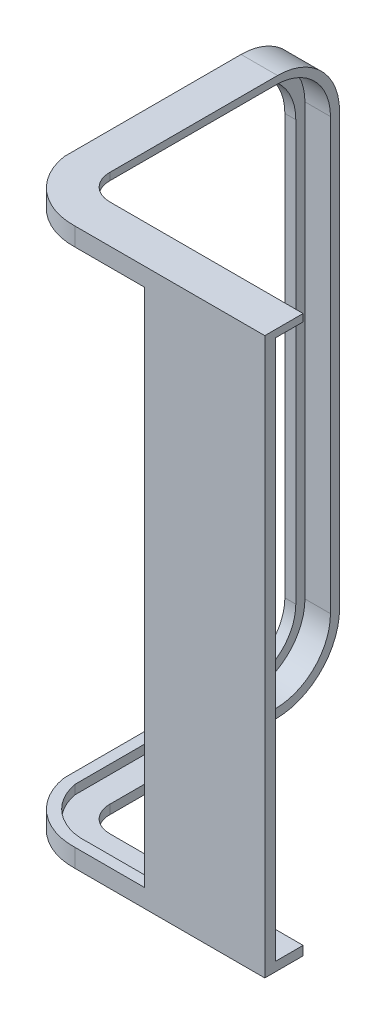
ISO-10303-21;
HEADER;
FILE_DESCRIPTION(('STEP AP214'),'2;1');
FILE_NAME('part.step','',(''),(''),'','','');
FILE_SCHEMA(('AUTOMOTIVE_DESIGN { 1 0 10303 214 1 1 1 1 }'));
ENDSEC;
DATA;
#1=APPLICATION_CONTEXT('core data for automotive mechanical design processes');
#2=APPLICATION_PROTOCOL_DEFINITION('international standard','automotive_design',2000,#1);
#3=PRODUCT_CONTEXT('',#1,'mechanical');
#4=PRODUCT('Part','Part','',(#3));
#5=PRODUCT_RELATED_PRODUCT_CATEGORY('part','',(#4));
#6=PRODUCT_DEFINITION_FORMATION('','',#4);
#7=PRODUCT_DEFINITION_CONTEXT('part definition',#1,'design');
#8=PRODUCT_DEFINITION('design','',#6,#7);
#9=PRODUCT_DEFINITION_SHAPE('','',#8);
#10=(LENGTH_UNIT() NAMED_UNIT(*) SI_UNIT(.MILLI.,.METRE.));
#11=(NAMED_UNIT(*) PLANE_ANGLE_UNIT() SI_UNIT($,.RADIAN.));
#12=(NAMED_UNIT(*) SI_UNIT($,.STERADIAN.) SOLID_ANGLE_UNIT());
#13=UNCERTAINTY_MEASURE_WITH_UNIT(LENGTH_MEASURE(1.E-05),#10,'distance_accuracy_value','');
#14=(GEOMETRIC_REPRESENTATION_CONTEXT(3) GLOBAL_UNCERTAINTY_ASSIGNED_CONTEXT((#13)) GLOBAL_UNIT_ASSIGNED_CONTEXT((#10,
#11,#12)) REPRESENTATION_CONTEXT('',''));
#15=CARTESIAN_POINT('',(0.,0.,0.));
#16=DIRECTION('',(0.,0.,1.));
#17=DIRECTION('',(1.,0.,0.));
#18=AXIS2_PLACEMENT_3D('',#15,#16,#17);
#19=CARTESIAN_POINT('',(-38.5,148.,3.));
#20=DIRECTION('',(-1.,0.,0.));
#21=DIRECTION('',(0.,0.,1.));
#22=AXIS2_PLACEMENT_3D('',#19,#20,#21);
#23=PLANE('',#22);
#24=DIRECTION('',(0.,-1.,0.));
#25=VECTOR('',#24,1.);
#26=CARTESIAN_POINT('',(-38.5,148.,0.));
#27=LINE('',#26,#25);
#28=CARTESIAN_POINT('',(-38.5,148.000000000001,0.));
#29=VERTEX_POINT('',#28);
#30=CARTESIAN_POINT('',(-38.5,0.,0.));
#31=VERTEX_POINT('',#30);
#32=EDGE_CURVE('E262',#29,#31,#27,.T.);
#33=ORIENTED_EDGE('',*,*,#32,.F.);
#34=DIRECTION('',(0.,0.,1.));
#35=VECTOR('',#34,1.);
#36=CARTESIAN_POINT('',(-38.5,148.000000000001,-14.6342860104149));
#37=LINE('',#36,#35);
#38=CARTESIAN_POINT('',(-38.5,148.000000000001,-7.50000000000164));
#39=VERTEX_POINT('',#38);
#40=EDGE_CURVE('E393',#39,#29,#37,.T.);
#41=ORIENTED_EDGE('',*,*,#40,.F.);
#42=DIRECTION('',(0.,-1.,0.));
#43=VECTOR('',#42,1.);
#44=CARTESIAN_POINT('',(-38.5,150.000000000001,-7.50000000000167));
#45=LINE('',#44,#43);
#46=CARTESIAN_POINT('',(-38.5,150.000000000001,-7.50000000000166));
#47=VERTEX_POINT('',#46);
#48=EDGE_CURVE('E267',#47,#39,#45,.T.);
#49=ORIENTED_EDGE('',*,*,#48,.F.);
#50=DIRECTION('',(0.,0.,1.));
#51=VECTOR('',#50,1.);
#52=CARTESIAN_POINT('',(-38.5,150.000000000001,-14.634286010415));
#53=LINE('',#52,#51);
#54=CARTESIAN_POINT('',(-38.5,150.000000000001,3.00000000000005));
#55=VERTEX_POINT('',#54);
#56=EDGE_CURVE('E265',#47,#55,#53,.T.);
#57=ORIENTED_EDGE('',*,*,#56,.T.);
#58=DIRECTION('',(0.,-1.,0.));
#59=VECTOR('',#58,1.);
#60=CARTESIAN_POINT('',(-38.5,148.,3.));
#61=LINE('',#60,#59);
#62=CARTESIAN_POINT('',(-38.5,-2.5,3.));
#63=VERTEX_POINT('',#62);
#64=EDGE_CURVE('E251',#55,#63,#61,.T.);
#65=ORIENTED_EDGE('',*,*,#64,.T.);
#66=DIRECTION('',(0.,0.,1.));
#67=VECTOR('',#66,1.);
#68=CARTESIAN_POINT('',(-38.5,-2.5,-7.5));
#69=LINE('',#68,#67);
#70=CARTESIAN_POINT('',(-38.5,-2.5,-7.5));
#71=VERTEX_POINT('',#70);
#72=EDGE_CURVE('E397',#71,#63,#69,.T.);
#73=ORIENTED_EDGE('',*,*,#72,.F.);
#74=DIRECTION('',(0.,-1.,0.));
#75=VECTOR('',#74,1.);
#76=CARTESIAN_POINT('',(-38.5,0.,-7.5));
#77=LINE('',#76,#75);
#78=CARTESIAN_POINT('',(-38.5,0.,-7.5));
#79=VERTEX_POINT('',#78);
#80=EDGE_CURVE('E379',#79,#71,#77,.T.);
#81=ORIENTED_EDGE('',*,*,#80,.F.);
#82=DIRECTION('',(0.,0.,-1.));
#83=VECTOR('',#82,1.);
#84=CARTESIAN_POINT('',(-38.5,0.,0.));
#85=LINE('',#84,#83);
#86=EDGE_CURVE('E390',#31,#79,#85,.T.);
#87=ORIENTED_EDGE('',*,*,#86,.F.);
#88=EDGE_LOOP('',(#33,#41,#49,#57,#65,#73,#81,#87));
#89=FACE_BOUND('',#88,.T.);
#90=ADVANCED_FACE('F38',(#89),#23,.F.);
#91=CARTESIAN_POINT('',(91.0545653325302,148.000000000001,-14.6342860104149));
#92=DIRECTION('',(0.,1.,0.));
#93=DIRECTION('',(0.,0.,1.));
#94=AXIS2_PLACEMENT_3D('',#91,#92,#93);
#95=PLANE('',#94);
#96=DIRECTION('',(-1.,0.,0.));
#97=VECTOR('',#96,1.);
#98=CARTESIAN_POINT('',(0.,148.000000000001,-7.50000000000164));
#99=LINE('',#98,#97);
#100=CARTESIAN_POINT('',(-91.5,148.000000000001,-7.50000000000164));
#101=VERTEX_POINT('',#100);
#102=EDGE_CURVE('E284',#39,#101,#99,.T.);
#103=ORIENTED_EDGE('',*,*,#102,.F.);
#104=ORIENTED_EDGE('',*,*,#40,.T.);
#105=DIRECTION('',(-1.,0.,0.));
#106=VECTOR('',#105,1.);
#107=CARTESIAN_POINT('',(71.5,148.,0.));
#108=LINE('',#107,#106);
#109=CARTESIAN_POINT('',(-71.5,148.,0.));
#110=VERTEX_POINT('',#109);
#111=EDGE_CURVE('E297',#29,#110,#108,.T.);
#112=ORIENTED_EDGE('',*,*,#111,.T.);
#113=DIRECTION('',(-0.999997928383092,0.,0.00203549245239582));
#114=VECTOR('',#113,1.);
#115=CARTESIAN_POINT('',(-90.4936212545622,148.000000000001,0.0386614527974023));
#116=LINE('',#115,#114);
#117=CARTESIAN_POINT('',(-90.4936212545622,148.000000000001,0.0386614527974026));
#118=VERTEX_POINT('',#117);
#119=EDGE_CURVE('E431',#110,#118,#116,.T.);
#120=ORIENTED_EDGE('',*,*,#119,.T.);
#121=CARTESIAN_POINT('',(-91.0545653325302,148.000000000001,-14.634286010415));
#122=DIRECTION('',(0.,-1.,0.));
#123=DIRECTION('',(0.,0.,-1.));
#124=AXIS2_PLACEMENT_3D('',#121,#122,#123);
#125=CIRCLE('',#124,14.6836659426997);
#126=CARTESIAN_POINT('',(-105.5,148.000000000001,-12.0000000000016));
#127=VERTEX_POINT('',#126);
#128=EDGE_CURVE('E425',#118,#127,#125,.T.);
#129=ORIENTED_EDGE('',*,*,#128,.T.);
#130=DIRECTION('',(0.,0.,1.));
#131=VECTOR('',#130,1.);
#132=CARTESIAN_POINT('',(-105.5,148.,-77.5));
#133=LINE('',#132,#131);
#134=CARTESIAN_POINT('',(-105.5,148.,-60.0000000000002));
#135=VERTEX_POINT('',#134);
#136=EDGE_CURVE('E705',#135,#127,#133,.T.);
#137=ORIENTED_EDGE('',*,*,#136,.F.);
#138=DIRECTION('',(-1.,0.,0.));
#139=VECTOR('',#138,1.);
#140=CARTESIAN_POINT('',(-98.5,148.,-60.0000000000002));
#141=LINE('',#140,#139);
#142=CARTESIAN_POINT('',(-98.5,148.,-60.0000000000002));
#143=VERTEX_POINT('',#142);
#144=EDGE_CURVE('E610',#135,#143,#141,.F.);
#145=ORIENTED_EDGE('',*,*,#144,.T.);
#146=DIRECTION('',(0.,0.,1.));
#147=VECTOR('',#146,1.);
#148=CARTESIAN_POINT('',(-98.5,148.,-77.5));
#149=LINE('',#148,#147);
#150=CARTESIAN_POINT('',(-98.5,148.000000000001,-14.5000000000016));
#151=VERTEX_POINT('',#150);
#152=EDGE_CURVE('E476',#143,#151,#149,.T.);
#153=ORIENTED_EDGE('',*,*,#152,.T.);
#154=CARTESIAN_POINT('',(-91.5,148.000000000001,-14.5000000000016));
#155=DIRECTION('',(0.,1.,0.));
#156=DIRECTION('',(0.,0.,1.));
#157=AXIS2_PLACEMENT_3D('',#154,#155,#156);
#158=CIRCLE('',#157,7.);
#159=EDGE_CURVE('E467',#151,#101,#158,.T.);
#160=ORIENTED_EDGE('',*,*,#159,.T.);
#161=EDGE_LOOP('',(#103,#104,#112,#120,#129,#137,#145,#153,#160));
#162=FACE_BOUND('',#161,.T.);
#163=ADVANCED_FACE('F350',(#162),#95,.F.);
#164=CARTESIAN_POINT('',(105.5,0.,0.));
#165=DIRECTION('',(0.,-1.,0.));
#166=DIRECTION('',(0.,0.,-1.));
#167=AXIS2_PLACEMENT_3D('',#164,#165,#166);
#168=PLANE('',#167);
#169=DIRECTION('',(-1.,0.,0.));
#170=VECTOR('',#169,1.);
#171=CARTESIAN_POINT('',(71.5,0.,0.));
#172=LINE('',#171,#170);
#173=CARTESIAN_POINT('',(-90.4936212545622,0.,0.));
#174=VERTEX_POINT('',#173);
#175=EDGE_CURVE('E261',#31,#174,#172,.T.);
#176=ORIENTED_EDGE('',*,*,#175,.F.);
#177=ORIENTED_EDGE('',*,*,#86,.T.);
#178=DIRECTION('',(-1.,0.,0.));
#179=VECTOR('',#178,1.);
#180=CARTESIAN_POINT('',(105.5,0.,-7.5));
#181=LINE('',#180,#179);
#182=CARTESIAN_POINT('',(-91.5,0.,-7.5));
#183=VERTEX_POINT('',#182);
#184=EDGE_CURVE('E300',#79,#183,#181,.T.);
#185=ORIENTED_EDGE('',*,*,#184,.T.);
#186=CARTESIAN_POINT('',(-91.5,0.,-14.5));
#187=DIRECTION('',(0.,-1.,0.));
#188=DIRECTION('',(0.,0.,-1.));
#189=AXIS2_PLACEMENT_3D('',#186,#187,#188);
#190=CIRCLE('',#189,7.);
#191=CARTESIAN_POINT('',(-98.5,0.,-14.5));
#192=VERTEX_POINT('',#191);
#193=EDGE_CURVE('E387',#183,#192,#190,.T.);
#194=ORIENTED_EDGE('',*,*,#193,.T.);
#195=DIRECTION('',(0.,0.,1.));
#196=VECTOR('',#195,1.);
#197=CARTESIAN_POINT('',(-98.5,0.,-7.5));
#198=LINE('',#197,#196);
#199=CARTESIAN_POINT('',(-98.5,0.,-60.));
#200=VERTEX_POINT('',#199);
#201=EDGE_CURVE('E667',#200,#192,#198,.T.);
#202=ORIENTED_EDGE('',*,*,#201,.F.);
#203=DIRECTION('',(-1.,0.,0.));
#204=VECTOR('',#203,1.);
#205=CARTESIAN_POINT('',(-98.5,0.,-60.));
#206=LINE('',#205,#204);
#207=CARTESIAN_POINT('',(-105.5,0.,-60.));
#208=VERTEX_POINT('',#207);
#209=EDGE_CURVE('E654',#200,#208,#206,.T.);
#210=ORIENTED_EDGE('',*,*,#209,.T.);
#211=DIRECTION('',(0.,0.,1.));
#212=VECTOR('',#211,1.);
#213=CARTESIAN_POINT('',(-105.5,0.,-7.5));
#214=LINE('',#213,#212);
#215=CARTESIAN_POINT('',(-105.5,0.,-12.));
#216=VERTEX_POINT('',#215);
#217=EDGE_CURVE('E655',#208,#216,#214,.T.);
#218=ORIENTED_EDGE('',*,*,#217,.T.);
#219=CARTESIAN_POINT('',(-91.0545653325302,0.,-14.6342860104133));
#220=DIRECTION('',(0.,-1.,0.));
#221=DIRECTION('',(0.,0.,-1.));
#222=AXIS2_PLACEMENT_3D('',#219,#220,#221);
#223=CIRCLE('',#222,14.6836659426997);
#224=CARTESIAN_POINT('',(-90.4936212545622,0.,0.0386614527990454));
#225=VERTEX_POINT('',#224);
#226=EDGE_CURVE('E517',#216,#225,#223,.F.);
#227=ORIENTED_EDGE('',*,*,#226,.T.);
#228=DIRECTION('',(0.,0.,-1.));
#229=VECTOR('',#228,1.);
#230=CARTESIAN_POINT('',(-90.4936212545622,0.,184.004522427478));
#231=LINE('',#230,#229);
#232=EDGE_CURVE('E416',#225,#174,#231,.T.);
#233=ORIENTED_EDGE('',*,*,#232,.T.);
#234=EDGE_LOOP('',(#176,#177,#185,#194,#202,#210,#218,#227,#233));
#235=FACE_BOUND('',#234,.T.);
#236=ADVANCED_FACE('F356',(#235),#168,.F.);
#237=CARTESIAN_POINT('',(-71.5,148.,3.));
#238=DIRECTION('',(1.,0.,0.));
#239=DIRECTION('',(0.,0.,-1.));
#240=AXIS2_PLACEMENT_3D('',#237,#238,#239);
#241=PLANE('',#240);
#242=DIRECTION('',(0.,0.,-1.));
#243=VECTOR('',#242,1.);
#244=CARTESIAN_POINT('',(-71.5,2.5,3.));
#245=LINE('',#244,#243);
#246=CARTESIAN_POINT('',(-71.5,2.5,3.));
#247=VERTEX_POINT('',#246);
#248=CARTESIAN_POINT('',(-71.5,2.5,0.));
#249=VERTEX_POINT('',#248);
#250=EDGE_CURVE('E422',#247,#249,#245,.T.);
#251=ORIENTED_EDGE('',*,*,#250,.F.);
#252=DIRECTION('',(0.,-1.,0.));
#253=VECTOR('',#252,1.);
#254=CARTESIAN_POINT('',(-71.5,148.,3.));
#255=LINE('',#254,#253);
#256=CARTESIAN_POINT('',(-71.5,145.000000000001,3.));
#257=VERTEX_POINT('',#256);
#258=EDGE_CURVE('E276',#257,#247,#255,.T.);
#259=ORIENTED_EDGE('',*,*,#258,.F.);
#260=DIRECTION('',(0.,0.,-1.));
#261=VECTOR('',#260,1.);
#262=CARTESIAN_POINT('',(-71.5,145.000000000001,-1.60982338570649E-12));
#263=LINE('',#262,#261);
#264=CARTESIAN_POINT('',(-71.5,145.000000000001,0.));
#265=VERTEX_POINT('',#264);
#266=EDGE_CURVE('E439',#257,#265,#263,.T.);
#267=ORIENTED_EDGE('',*,*,#266,.T.);
#268=DIRECTION('',(0.,-1.,0.));
#269=VECTOR('',#268,1.);
#270=CARTESIAN_POINT('',(-71.5,148.,0.));
#271=LINE('',#270,#269);
#272=EDGE_CURVE('E282',#265,#249,#271,.T.);
#273=ORIENTED_EDGE('',*,*,#272,.T.);
#274=EDGE_LOOP('',(#251,#259,#267,#273));
#275=FACE_BOUND('',#274,.T.);
#276=ADVANCED_FACE('F361',(#275),#241,.F.);
#277=CARTESIAN_POINT('',(105.5,0.,-7.5));
#278=DIRECTION('',(0.,0.,1.));
#279=DIRECTION('',(1.,0.,0.));
#280=AXIS2_PLACEMENT_3D('',#277,#278,#279);
#281=PLANE('',#280);
#282=ORIENTED_EDGE('',*,*,#184,.F.);
#283=ORIENTED_EDGE('',*,*,#80,.T.);
#284=DIRECTION('',(-1.,0.,0.));
#285=VECTOR('',#284,1.);
#286=CARTESIAN_POINT('',(105.5,-2.5,-7.5));
#287=LINE('',#286,#285);
#288=CARTESIAN_POINT('',(-91.5,-2.5,-7.5));
#289=VERTEX_POINT('',#288);
#290=EDGE_CURVE('E305',#71,#289,#287,.T.);
#291=ORIENTED_EDGE('',*,*,#290,.T.);
#292=DIRECTION('',(0.,-1.,0.));
#293=VECTOR('',#292,1.);
#294=CARTESIAN_POINT('',(-91.5,0.,-7.5));
#295=LINE('',#294,#293);
#296=EDGE_CURVE('E382',#289,#183,#295,.F.);
#297=ORIENTED_EDGE('',*,*,#296,.T.);
#298=EDGE_LOOP('',(#282,#283,#291,#297));
#299=FACE_BOUND('',#298,.T.);
#300=ADVANCED_FACE('F328',(#299),#281,.F.);
#301=CARTESIAN_POINT('',(105.5,-2.5,3.));
#302=DIRECTION('',(0.,0.,-1.));
#303=DIRECTION('',(0.,1.,0.));
#304=AXIS2_PLACEMENT_3D('',#301,#302,#303);
#305=PLANE('',#304);
#306=DIRECTION('',(-1.,0.,0.));
#307=VECTOR('',#306,1.);
#308=CARTESIAN_POINT('',(105.5,-2.5,3.));
#309=LINE('',#308,#307);
#310=CARTESIAN_POINT('',(-90.4936425739193,-2.5,2.99999932186008));
#311=VERTEX_POINT('',#310);
#312=EDGE_CURVE('E42',#63,#311,#309,.T.);
#313=ORIENTED_EDGE('',*,*,#312,.F.);
#314=ORIENTED_EDGE('',*,*,#64,.F.);
#315=DIRECTION('',(1.,0.,0.));
#316=VECTOR('',#315,1.);
#317=CARTESIAN_POINT('',(90.4936212545622,150.000000000001,2.99999864371852));
#318=LINE('',#317,#316);
#319=CARTESIAN_POINT('',(-90.4936212545622,150.000000000001,2.99999864371852));
#320=VERTEX_POINT('',#319);
#321=EDGE_CURVE('E255',#320,#55,#318,.T.);
#322=ORIENTED_EDGE('',*,*,#321,.F.);
#323=DIRECTION('',(0.,-1.,0.));
#324=VECTOR('',#323,1.);
#325=CARTESIAN_POINT('',(-90.4936212545622,150.000000000001,2.99999864371852));
#326=LINE('',#325,#324);
#327=CARTESIAN_POINT('',(-90.4936319142405,148.000000000001,2.99999898279495));
#328=VERTEX_POINT('',#327);
#329=EDGE_CURVE('E499',#320,#328,#326,.T.);
#330=ORIENTED_EDGE('',*,*,#329,.T.);
#331=DIRECTION('',(0.,1.,0.));
#332=VECTOR('',#331,1.);
#333=CARTESIAN_POINT('',(-90.4936425739189,145.000000000001,2.99999932187134));
#334=LINE('',#333,#332);
#335=CARTESIAN_POINT('',(-90.4936425739189,145.000000000001,2.99999932187134));
#336=VERTEX_POINT('',#335);
#337=EDGE_CURVE('E453',#336,#328,#334,.T.);
#338=ORIENTED_EDGE('',*,*,#337,.F.);
#339=DIRECTION('',(1.,0.,3.57028435066687E-08));
#340=VECTOR('',#339,1.);
#341=CARTESIAN_POINT('',(-71.5,145.000000000001,2.99999999999839));
#342=LINE('',#341,#340);
#343=EDGE_CURVE('E442',#336,#257,#342,.T.);
#344=ORIENTED_EDGE('',*,*,#343,.T.);
#345=ORIENTED_EDGE('',*,*,#258,.T.);
#346=DIRECTION('',(1.,0.,0.));
#347=VECTOR('',#346,1.);
#348=CARTESIAN_POINT('',(-90.4936212545622,2.5,3.));
#349=LINE('',#348,#347);
#350=CARTESIAN_POINT('',(-90.4936212545622,2.5,3.));
#351=VERTEX_POINT('',#350);
#352=EDGE_CURVE('E419',#351,#247,#349,.T.);
#353=ORIENTED_EDGE('',*,*,#352,.F.);
#354=DIRECTION('',(0.,-1.,0.));
#355=VECTOR('',#354,1.);
#356=CARTESIAN_POINT('',(-90.4936212545622,2.5,2.99999864372016));
#357=LINE('',#356,#355);
#358=CARTESIAN_POINT('',(-90.4936355874581,0.,2.99999955554023));
#359=VERTEX_POINT('',#358);
#360=EDGE_CURVE('E516',#351,#359,#357,.T.);
#361=ORIENTED_EDGE('',*,*,#360,.T.);
#362=CARTESIAN_POINT('',(-90.4936212545622,0.,3.));
#363=DIRECTION('',(0.,-1.,0.));
#364=VECTOR('',#363,1.);
#365=LINE('',#362,#364);
#366=EDGE_CURVE('E311',#359,#311,#365,.T.);
#367=ORIENTED_EDGE('',*,*,#366,.T.);
#368=EDGE_LOOP('',(#313,#314,#322,#330,#338,#344,#345,#353,#361,#367));
#369=FACE_BOUND('',#368,.T.);
#370=ADVANCED_FACE('F253',(#369),#305,.F.);
#371=CARTESIAN_POINT('',(105.5,-2.5,-7.5));
#372=DIRECTION('',(0.,1.,0.));
#373=DIRECTION('',(0.,0.,1.));
#374=AXIS2_PLACEMENT_3D('',#371,#372,#373);
#375=PLANE('',#374);
#376=ORIENTED_EDGE('',*,*,#290,.F.);
#377=ORIENTED_EDGE('',*,*,#72,.T.);
#378=ORIENTED_EDGE('',*,*,#312,.T.);
#379=CARTESIAN_POINT('',(-91.0545653325302,-2.5,-14.6342860104133));
#380=DIRECTION('',(0.,-1.,0.));
#381=DIRECTION('',(0.,0.,-1.));
#382=AXIS2_PLACEMENT_3D('',#379,#380,#381);
#383=CIRCLE('',#382,17.6432041738913);
#384=CARTESIAN_POINT('',(-108.5,-2.5,-12.));
#385=VERTEX_POINT('',#384);
#386=EDGE_CURVE('E504',#311,#385,#383,.T.);
#387=ORIENTED_EDGE('',*,*,#386,.T.);
#388=DIRECTION('',(0.,0.,-1.));
#389=VECTOR('',#388,1.);
#390=CARTESIAN_POINT('',(-108.5,-2.5,-12.));
#391=LINE('',#390,#389);
#392=CARTESIAN_POINT('',(-108.5,-2.5,-60.));
#393=VERTEX_POINT('',#392);
#394=EDGE_CURVE('E697',#385,#393,#391,.T.);
#395=ORIENTED_EDGE('',*,*,#394,.T.);
#396=DIRECTION('',(-1.,0.,0.));
#397=VECTOR('',#396,1.);
#398=CARTESIAN_POINT('',(-98.5,-2.5,-60.));
#399=LINE('',#398,#397);
#400=CARTESIAN_POINT('',(-98.5,-2.5,-60.));
#401=VERTEX_POINT('',#400);
#402=EDGE_CURVE('E289',#401,#393,#399,.T.);
#403=ORIENTED_EDGE('',*,*,#402,.F.);
#404=DIRECTION('',(0.,0.,-1.));
#405=VECTOR('',#404,1.);
#406=CARTESIAN_POINT('',(-98.5,-2.5,-7.5));
#407=LINE('',#406,#405);
#408=CARTESIAN_POINT('',(-98.5,-2.5,-14.5));
#409=VERTEX_POINT('',#408);
#410=EDGE_CURVE('E646',#409,#401,#407,.T.);
#411=ORIENTED_EDGE('',*,*,#410,.F.);
#412=CARTESIAN_POINT('',(-91.5,-2.5,-14.5));
#413=DIRECTION('',(0.,1.,0.));
#414=DIRECTION('',(0.,0.,1.));
#415=AXIS2_PLACEMENT_3D('',#412,#413,#414);
#416=CIRCLE('',#415,7.);
#417=EDGE_CURVE('E790',#409,#289,#416,.T.);
#418=ORIENTED_EDGE('',*,*,#417,.T.);
#419=EDGE_LOOP('',(#376,#377,#378,#387,#395,#403,#411,#418));
#420=FACE_BOUND('',#419,.T.);
#421=ADVANCED_FACE('F327',(#420),#375,.F.);
#422=CARTESIAN_POINT('',(71.5,148.,0.));
#423=DIRECTION('',(0.,0.,1.));
#424=DIRECTION('',(1.,0.,0.));
#425=AXIS2_PLACEMENT_3D('',#422,#423,#424);
#426=PLANE('',#425);
#427=ORIENTED_EDGE('',*,*,#111,.F.);
#428=ORIENTED_EDGE('',*,*,#32,.T.);
#429=ORIENTED_EDGE('',*,*,#175,.T.);
#430=DIRECTION('',(0.,-1.,0.));
#431=VECTOR('',#430,1.);
#432=CARTESIAN_POINT('',(-90.4936212545622,2.5,0.));
#433=LINE('',#432,#431);
#434=CARTESIAN_POINT('',(-90.4936212545622,2.5,0.));
#435=VERTEX_POINT('',#434);
#436=EDGE_CURVE('E405',#435,#174,#433,.T.);
#437=ORIENTED_EDGE('',*,*,#436,.F.);
#438=DIRECTION('',(-1.,0.,0.));
#439=VECTOR('',#438,1.);
#440=CARTESIAN_POINT('',(-90.4936212545622,2.5,0.));
#441=LINE('',#440,#439);
#442=EDGE_CURVE('E409',#249,#435,#441,.T.);
#443=ORIENTED_EDGE('',*,*,#442,.F.);
#444=ORIENTED_EDGE('',*,*,#272,.F.);
#445=EDGE_CURVE('E291',#110,#265,#271,.T.);
#446=ORIENTED_EDGE('',*,*,#445,.F.);
#447=EDGE_LOOP('',(#427,#428,#429,#437,#443,#444,#446));
#448=FACE_BOUND('',#447,.T.);
#449=ADVANCED_FACE('F363',(#448),#426,.F.);
#450=CARTESIAN_POINT('',(0.,150.000000000001,-7.50000000000167));
#451=DIRECTION('',(0.,0.,1.));
#452=DIRECTION('',(0.,-1.,0.));
#453=AXIS2_PLACEMENT_3D('',#450,#451,#452);
#454=PLANE('',#453);
#455=DIRECTION('',(-1.,0.,0.));
#456=VECTOR('',#455,1.);
#457=CARTESIAN_POINT('',(0.,150.000000000001,-7.50000000000167));
#458=LINE('',#457,#456);
#459=CARTESIAN_POINT('',(-91.5,150.000000000001,-7.50000000000166));
#460=VERTEX_POINT('',#459);
#461=EDGE_CURVE('E277',#47,#460,#458,.T.);
#462=ORIENTED_EDGE('',*,*,#461,.F.);
#463=ORIENTED_EDGE('',*,*,#48,.T.);
#464=ORIENTED_EDGE('',*,*,#102,.T.);
#465=DIRECTION('',(0.,-1.,0.));
#466=VECTOR('',#465,1.);
#467=CARTESIAN_POINT('',(-91.5,150.000000000001,-7.50000000000166));
#468=LINE('',#467,#466);
#469=EDGE_CURVE('E495',#460,#101,#468,.T.);
#470=ORIENTED_EDGE('',*,*,#469,.F.);
#471=EDGE_LOOP('',(#462,#463,#464,#470));
#472=FACE_BOUND('',#471,.T.);
#473=ADVANCED_FACE('F366',(#472),#454,.F.);
#474=CARTESIAN_POINT('',(91.0545653325302,150.000000000001,-14.634286010415));
#475=DIRECTION('',(0.,1.,0.));
#476=DIRECTION('',(0.,0.,1.));
#477=AXIS2_PLACEMENT_3D('',#474,#475,#476);
#478=PLANE('',#477);
#479=ORIENTED_EDGE('',*,*,#56,.F.);
#480=ORIENTED_EDGE('',*,*,#461,.T.);
#481=CARTESIAN_POINT('',(-91.5,150.000000000001,-14.5000000000017));
#482=DIRECTION('',(0.,1.,0.));
#483=DIRECTION('',(0.,0.,1.));
#484=AXIS2_PLACEMENT_3D('',#481,#482,#483);
#485=CIRCLE('',#484,7.);
#486=CARTESIAN_POINT('',(-98.5,150.000000000001,-14.5000000000017));
#487=VERTEX_POINT('',#486);
#488=EDGE_CURVE('E479',#487,#460,#485,.T.);
#489=ORIENTED_EDGE('',*,*,#488,.F.);
#490=DIRECTION('',(0.,0.,1.));
#491=VECTOR('',#490,1.);
#492=CARTESIAN_POINT('',(-98.5,150.,-77.5));
#493=LINE('',#492,#491);
#494=CARTESIAN_POINT('',(-98.5,150.,-60.5000000000002));
#495=VERTEX_POINT('',#494);
#496=EDGE_CURVE('E483',#495,#487,#493,.T.);
#497=ORIENTED_EDGE('',*,*,#496,.F.);
#498=DIRECTION('',(1.,0.,0.));
#499=VECTOR('',#498,1.);
#500=CARTESIAN_POINT('',(-108.5,150.,-60.5000000000002));
#501=LINE('',#500,#499);
#502=CARTESIAN_POINT('',(-108.5,150.,-60.5000000000002));
#503=VERTEX_POINT('',#502);
#504=EDGE_CURVE('E49',#495,#503,#501,.F.);
#505=ORIENTED_EDGE('',*,*,#504,.T.);
#506=DIRECTION('',(0.,0.,-1.));
#507=VECTOR('',#506,1.);
#508=CARTESIAN_POINT('',(-108.5,150.,-77.5));
#509=LINE('',#508,#507);
#510=CARTESIAN_POINT('',(-108.5,150.000000000001,-12.0000000000017));
#511=VERTEX_POINT('',#510);
#512=EDGE_CURVE('E473',#511,#503,#509,.T.);
#513=ORIENTED_EDGE('',*,*,#512,.F.);
#514=CARTESIAN_POINT('',(-91.0545653325302,150.000000000001,-14.634286010415));
#515=DIRECTION('',(0.,-1.,0.));
#516=DIRECTION('',(0.,0.,1.));
#517=AXIS2_PLACEMENT_3D('',#514,#515,#516);
#518=CIRCLE('',#517,17.6432041738913);
#519=EDGE_CURVE('E274',#320,#511,#518,.T.);
#520=ORIENTED_EDGE('',*,*,#519,.F.);
#521=ORIENTED_EDGE('',*,*,#321,.T.);
#522=EDGE_LOOP('',(#479,#480,#489,#497,#505,#513,#520,#521));
#523=FACE_BOUND('',#522,.T.);
#524=ADVANCED_FACE('F272',(#523),#478,.T.);
#525=CARTESIAN_POINT('',(-98.5,15.,-60.));
#526=DIRECTION('',(-1.,0.,0.));
#527=DIRECTION('',(0.,0.,1.));
#528=AXIS2_PLACEMENT_3D('',#525,#526,#527);
#529=CYLINDRICAL_SURFACE('',#528,17.5);
#530=ORIENTED_EDGE('',*,*,#402,.T.);
#531=CARTESIAN_POINT('',(-108.5,15.,-60.));
#532=DIRECTION('',(1.,0.,0.));
#533=DIRECTION('',(0.,0.,-1.));
#534=AXIS2_PLACEMENT_3D('',#531,#532,#533);
#535=CIRCLE('',#534,17.5);
#536=CARTESIAN_POINT('',(-108.5,15.,-77.5));
#537=VERTEX_POINT('',#536);
#538=EDGE_CURVE('E769',#393,#537,#535,.T.);
#539=ORIENTED_EDGE('',*,*,#538,.T.);
#540=DIRECTION('',(-1.,0.,0.));
#541=VECTOR('',#540,1.);
#542=CARTESIAN_POINT('',(-98.5,15.,-77.5));
#543=LINE('',#542,#541);
#544=CARTESIAN_POINT('',(-98.5,15.,-77.5));
#545=VERTEX_POINT('',#544);
#546=EDGE_CURVE('E670',#545,#537,#543,.T.);
#547=ORIENTED_EDGE('',*,*,#546,.F.);
#548=CARTESIAN_POINT('',(-98.5,15.,-60.));
#549=DIRECTION('',(1.,0.,0.));
#550=DIRECTION('',(0.,0.,-1.));
#551=AXIS2_PLACEMENT_3D('',#548,#549,#550);
#552=CIRCLE('',#551,17.5);
#553=EDGE_CURVE('E639',#401,#545,#552,.T.);
#554=ORIENTED_EDGE('',*,*,#553,.F.);
#555=EDGE_LOOP('',(#530,#539,#547,#554));
#556=FACE_BOUND('',#555,.T.);
#557=ADVANCED_FACE('F578',(#556),#529,.T.);
#558=CARTESIAN_POINT('',(-98.5,148.,-77.5));
#559=DIRECTION('',(0.,0.,1.));
#560=DIRECTION('',(0.,-1.,0.));
#561=AXIS2_PLACEMENT_3D('',#558,#559,#560);
#562=PLANE('',#561);
#563=DIRECTION('',(0.,1.,0.));
#564=VECTOR('',#563,1.);
#565=CARTESIAN_POINT('',(-108.5,15.,-77.5));
#566=LINE('',#565,#564);
#567=CARTESIAN_POINT('',(-108.5,133.,-77.5));
#568=VERTEX_POINT('',#567);
#569=EDGE_CURVE('E636',#537,#568,#566,.T.);
#570=ORIENTED_EDGE('',*,*,#569,.T.);
#571=DIRECTION('',(1.,0.,0.));
#572=VECTOR('',#571,1.);
#573=CARTESIAN_POINT('',(-98.5,133.,-77.5));
#574=LINE('',#573,#572);
#575=CARTESIAN_POINT('',(-98.5,133.,-77.5));
#576=VERTEX_POINT('',#575);
#577=EDGE_CURVE('E619',#568,#576,#574,.T.);
#578=ORIENTED_EDGE('',*,*,#577,.T.);
#579=DIRECTION('',(0.,1.,0.));
#580=VECTOR('',#579,1.);
#581=CARTESIAN_POINT('',(-98.5,148.,-77.5));
#582=LINE('',#581,#580);
#583=EDGE_CURVE('E634',#545,#576,#582,.T.);
#584=ORIENTED_EDGE('',*,*,#583,.F.);
#585=ORIENTED_EDGE('',*,*,#546,.T.);
#586=EDGE_LOOP('',(#570,#578,#584,#585));
#587=FACE_BOUND('',#586,.T.);
#588=ADVANCED_FACE('F581',(#587),#562,.F.);
#589=CARTESIAN_POINT('',(-98.5,15.,-75.));
#590=DIRECTION('',(0.,0.,-1.));
#591=DIRECTION('',(-1.,0.,0.));
#592=AXIS2_PLACEMENT_3D('',#589,#590,#591);
#593=PLANE('',#592);
#594=DIRECTION('',(0.,-1.,0.));
#595=VECTOR('',#594,1.);
#596=CARTESIAN_POINT('',(-98.5,15.,-75.));
#597=LINE('',#596,#595);
#598=CARTESIAN_POINT('',(-98.5,133.,-75.));
#599=VERTEX_POINT('',#598);
#600=CARTESIAN_POINT('',(-98.5,15.,-75.));
#601=VERTEX_POINT('',#600);
#602=EDGE_CURVE('E642',#599,#601,#597,.T.);
#603=ORIENTED_EDGE('',*,*,#602,.F.);
#604=DIRECTION('',(-1.,0.,0.));
#605=VECTOR('',#604,1.);
#606=CARTESIAN_POINT('',(-105.5,133.,-75.));
#607=LINE('',#606,#605);
#608=CARTESIAN_POINT('',(-105.5,133.,-75.));
#609=VERTEX_POINT('',#608);
#610=EDGE_CURVE('E612',#599,#609,#607,.T.);
#611=ORIENTED_EDGE('',*,*,#610,.T.);
#612=DIRECTION('',(0.,-1.,0.));
#613=VECTOR('',#612,1.);
#614=CARTESIAN_POINT('',(-105.5,15.,-75.));
#615=LINE('',#614,#613);
#616=CARTESIAN_POINT('',(-105.5,15.,-75.));
#617=VERTEX_POINT('',#616);
#618=EDGE_CURVE('E664',#609,#617,#615,.T.);
#619=ORIENTED_EDGE('',*,*,#618,.T.);
#620=DIRECTION('',(-1.,0.,0.));
#621=VECTOR('',#620,1.);
#622=CARTESIAN_POINT('',(-98.5,15.,-75.));
#623=LINE('',#622,#621);
#624=EDGE_CURVE('E673',#601,#617,#623,.T.);
#625=ORIENTED_EDGE('',*,*,#624,.F.);
#626=EDGE_LOOP('',(#603,#611,#619,#625));
#627=FACE_BOUND('',#626,.T.);
#628=ADVANCED_FACE('F585',(#627),#593,.F.);
#629=CARTESIAN_POINT('',(-98.5,15.,-60.));
#630=DIRECTION('',(-1.,0.,0.));
#631=DIRECTION('',(0.,0.,1.));
#632=AXIS2_PLACEMENT_3D('',#629,#630,#631);
#633=CYLINDRICAL_SURFACE('',#632,15.);
#634=CARTESIAN_POINT('',(-105.5,15.,-60.));
#635=DIRECTION('',(-1.,0.,0.));
#636=DIRECTION('',(0.,0.,-1.));
#637=AXIS2_PLACEMENT_3D('',#634,#635,#636);
#638=CIRCLE('',#637,15.);
#639=EDGE_CURVE('E659',#617,#208,#638,.T.);
#640=ORIENTED_EDGE('',*,*,#639,.T.);
#641=ORIENTED_EDGE('',*,*,#209,.F.);
#642=CARTESIAN_POINT('',(-98.5,15.,-60.));
#643=DIRECTION('',(-1.,0.,0.));
#644=DIRECTION('',(0.,0.,-1.));
#645=AXIS2_PLACEMENT_3D('',#642,#643,#644);
#646=CIRCLE('',#645,15.);
#647=EDGE_CURVE('E648',#601,#200,#646,.T.);
#648=ORIENTED_EDGE('',*,*,#647,.F.);
#649=ORIENTED_EDGE('',*,*,#624,.T.);
#650=EDGE_LOOP('',(#640,#641,#648,#649));
#651=FACE_BOUND('',#650,.T.);
#652=ADVANCED_FACE('F577',(#651),#633,.F.);
#653=CARTESIAN_POINT('',(-98.5,15.,-60.));
#654=DIRECTION('',(-1.,0.,0.));
#655=DIRECTION('',(0.,0.,-1.));
#656=AXIS2_PLACEMENT_3D('',#653,#654,#655);
#657=PLANE('',#656);
#658=ORIENTED_EDGE('',*,*,#583,.T.);
#659=CARTESIAN_POINT('',(-98.5,133.,-60.5));
#660=DIRECTION('',(-1.,0.,0.));
#661=DIRECTION('',(0.,0.,1.));
#662=AXIS2_PLACEMENT_3D('',#659,#660,#661);
#663=CIRCLE('',#662,17.);
#664=EDGE_CURVE('E63',#576,#495,#663,.F.);
#665=ORIENTED_EDGE('',*,*,#664,.T.);
#666=ORIENTED_EDGE('',*,*,#496,.T.);
#667=DIRECTION('',(0.,-1.,0.));
#668=VECTOR('',#667,1.);
#669=CARTESIAN_POINT('',(-98.5,150.000000000001,-14.5000000000017));
#670=LINE('',#669,#668);
#671=EDGE_CURVE('E486',#487,#151,#670,.T.);
#672=ORIENTED_EDGE('',*,*,#671,.T.);
#673=ORIENTED_EDGE('',*,*,#152,.F.);
#674=CARTESIAN_POINT('',(-98.5,133.,-60.));
#675=DIRECTION('',(-1.,0.,0.));
#676=DIRECTION('',(0.,0.,1.));
#677=AXIS2_PLACEMENT_3D('',#674,#675,#676);
#678=CIRCLE('',#677,15.);
#679=EDGE_CURVE('E606',#143,#599,#678,.T.);
#680=ORIENTED_EDGE('',*,*,#679,.T.);
#681=ORIENTED_EDGE('',*,*,#602,.T.);
#682=ORIENTED_EDGE('',*,*,#647,.T.);
#683=ORIENTED_EDGE('',*,*,#201,.T.);
#684=DIRECTION('',(0.,-1.,0.));
#685=VECTOR('',#684,1.);
#686=CARTESIAN_POINT('',(-98.5,-2.5,-14.5));
#687=LINE('',#686,#685);
#688=EDGE_CURVE('E316',#192,#409,#687,.T.);
#689=ORIENTED_EDGE('',*,*,#688,.T.);
#690=ORIENTED_EDGE('',*,*,#410,.T.);
#691=ORIENTED_EDGE('',*,*,#553,.T.);
#692=EDGE_LOOP('',(#658,#665,#666,#672,#673,#680,#681,#682,#683,#689,#690,#691));
#693=FACE_BOUND('',#692,.T.);
#694=ADVANCED_FACE('F573',(#693),#657,.F.);
#695=CARTESIAN_POINT('',(-108.5,2.5,-12.));
#696=DIRECTION('',(0.,1.,0.));
#697=DIRECTION('',(0.,0.,1.));
#698=AXIS2_PLACEMENT_3D('',#695,#696,#697);
#699=PLANE('',#698);
#700=DIRECTION('',(0.,0.,1.));
#701=VECTOR('',#700,1.);
#702=CARTESIAN_POINT('',(-105.5,2.5,-12.));
#703=LINE('',#702,#701);
#704=CARTESIAN_POINT('',(-105.5,2.5,-60.));
#705=VERTEX_POINT('',#704);
#706=CARTESIAN_POINT('',(-105.5,2.5,-12.));
#707=VERTEX_POINT('',#706);
#708=EDGE_CURVE('E688',#705,#707,#703,.T.);
#709=ORIENTED_EDGE('',*,*,#708,.F.);
#710=DIRECTION('',(1.,0.,0.));
#711=VECTOR('',#710,1.);
#712=CARTESIAN_POINT('',(-108.5,2.5,-60.));
#713=LINE('',#712,#711);
#714=CARTESIAN_POINT('',(-108.5,2.5,-60.));
#715=VERTEX_POINT('',#714);
#716=EDGE_CURVE('E660',#715,#705,#713,.T.);
#717=ORIENTED_EDGE('',*,*,#716,.F.);
#718=DIRECTION('',(0.,0.,1.));
#719=VECTOR('',#718,1.);
#720=CARTESIAN_POINT('',(-108.5,2.5,-12.));
#721=LINE('',#720,#719);
#722=CARTESIAN_POINT('',(-108.5,2.5,-12.));
#723=VERTEX_POINT('',#722);
#724=EDGE_CURVE('E780',#715,#723,#721,.T.);
#725=ORIENTED_EDGE('',*,*,#724,.T.);
#726=CARTESIAN_POINT('',(-91.0545653325302,2.5,-14.6342860104133));
#727=DIRECTION('',(0.,-1.,0.));
#728=DIRECTION('',(0.,0.,-1.));
#729=AXIS2_PLACEMENT_3D('',#726,#727,#728);
#730=CIRCLE('',#729,17.6432041738913);
#731=EDGE_CURVE('E509',#351,#723,#730,.T.);
#732=ORIENTED_EDGE('',*,*,#731,.F.);
#733=ORIENTED_EDGE('',*,*,#352,.T.);
#734=ORIENTED_EDGE('',*,*,#250,.T.);
#735=ORIENTED_EDGE('',*,*,#442,.T.);
#736=DIRECTION('',(0.,0.,-1.));
#737=VECTOR('',#736,1.);
#738=CARTESIAN_POINT('',(-90.4936212545622,2.5,184.004522427478));
#739=LINE('',#738,#737);
#740=CARTESIAN_POINT('',(-90.4936212545622,2.5,0.0386614527990436));
#741=VERTEX_POINT('',#740);
#742=EDGE_CURVE('E412',#741,#435,#739,.T.);
#743=ORIENTED_EDGE('',*,*,#742,.F.);
#744=CARTESIAN_POINT('',(-91.0545653325302,2.5,-14.6342860104133));
#745=DIRECTION('',(0.,1.,0.));
#746=DIRECTION('',(0.,0.,1.));
#747=AXIS2_PLACEMENT_3D('',#744,#745,#746);
#748=CIRCLE('',#747,14.6836659426997);
#749=EDGE_CURVE('E505',#707,#741,#748,.T.);
#750=ORIENTED_EDGE('',*,*,#749,.F.);
#751=EDGE_LOOP('',(#709,#717,#725,#732,#733,#734,#735,#743,#750));
#752=FACE_BOUND('',#751,.T.);
#753=ADVANCED_FACE('F569',(#752),#699,.T.);
#754=CARTESIAN_POINT('',(-108.5,15.,-60.));
#755=DIRECTION('',(1.,0.,0.));
#756=DIRECTION('',(0.,0.,-1.));
#757=AXIS2_PLACEMENT_3D('',#754,#755,#756);
#758=CYLINDRICAL_SURFACE('',#757,12.5);
#759=CARTESIAN_POINT('',(-105.5,15.,-60.));
#760=DIRECTION('',(-1.,0.,0.));
#761=DIRECTION('',(0.,0.,-1.));
#762=AXIS2_PLACEMENT_3D('',#759,#760,#761);
#763=CIRCLE('',#762,12.5);
#764=CARTESIAN_POINT('',(-105.5,15.,-72.5));
#765=VERTEX_POINT('',#764);
#766=EDGE_CURVE('E694',#765,#705,#763,.T.);
#767=ORIENTED_EDGE('',*,*,#766,.F.);
#768=DIRECTION('',(1.,0.,0.));
#769=VECTOR('',#768,1.);
#770=CARTESIAN_POINT('',(-108.5,15.,-72.5));
#771=LINE('',#770,#769);
#772=CARTESIAN_POINT('',(-108.5,15.,-72.5));
#773=VERTEX_POINT('',#772);
#774=EDGE_CURVE('E708',#773,#765,#771,.T.);
#775=ORIENTED_EDGE('',*,*,#774,.F.);
#776=CARTESIAN_POINT('',(-108.5,15.,-60.));
#777=DIRECTION('',(-1.,0.,0.));
#778=DIRECTION('',(0.,0.,-1.));
#779=AXIS2_PLACEMENT_3D('',#776,#777,#778);
#780=CIRCLE('',#779,12.5);
#781=EDGE_CURVE('E744',#773,#715,#780,.T.);
#782=ORIENTED_EDGE('',*,*,#781,.T.);
#783=ORIENTED_EDGE('',*,*,#716,.T.);
#784=EDGE_LOOP('',(#767,#775,#782,#783));
#785=FACE_BOUND('',#784,.T.);
#786=ADVANCED_FACE('F565',(#785),#758,.F.);
#787=CARTESIAN_POINT('',(-108.5,148.,-72.5));
#788=DIRECTION('',(0.,0.,1.));
#789=DIRECTION('',(0.,-1.,0.));
#790=AXIS2_PLACEMENT_3D('',#787,#788,#789);
#791=PLANE('',#790);
#792=DIRECTION('',(0.,-1.,0.));
#793=VECTOR('',#792,1.);
#794=CARTESIAN_POINT('',(-105.5,148.,-72.5));
#795=LINE('',#794,#793);
#796=CARTESIAN_POINT('',(-105.5,130.,-72.5));
#797=VERTEX_POINT('',#796);
#798=EDGE_CURVE('E702',#797,#765,#795,.T.);
#799=ORIENTED_EDGE('',*,*,#798,.F.);
#800=DIRECTION('',(-1.,0.,0.));
#801=VECTOR('',#800,1.);
#802=CARTESIAN_POINT('',(-108.5,130.,-72.5));
#803=LINE('',#802,#801);
#804=CARTESIAN_POINT('',(-108.5,130.,-72.5));
#805=VERTEX_POINT('',#804);
#806=EDGE_CURVE('E724',#797,#805,#803,.T.);
#807=ORIENTED_EDGE('',*,*,#806,.T.);
#808=DIRECTION('',(0.,-1.,0.));
#809=VECTOR('',#808,1.);
#810=CARTESIAN_POINT('',(-108.5,148.,-72.5));
#811=LINE('',#810,#809);
#812=EDGE_CURVE('E731',#805,#773,#811,.T.);
#813=ORIENTED_EDGE('',*,*,#812,.T.);
#814=ORIENTED_EDGE('',*,*,#774,.T.);
#815=EDGE_LOOP('',(#799,#807,#813,#814));
#816=FACE_BOUND('',#815,.T.);
#817=ADVANCED_FACE('F558',(#816),#791,.T.);
#818=CARTESIAN_POINT('',(-108.5,15.,-60.));
#819=DIRECTION('',(-1.,0.,0.));
#820=DIRECTION('',(0.,0.,-1.));
#821=AXIS2_PLACEMENT_3D('',#818,#819,#820);
#822=PLANE('',#821);
#823=ORIENTED_EDGE('',*,*,#512,.T.);
#824=CARTESIAN_POINT('',(-108.5,133.,-60.5));
#825=DIRECTION('',(-1.,0.,0.));
#826=DIRECTION('',(0.,0.,1.));
#827=AXIS2_PLACEMENT_3D('',#824,#825,#826);
#828=CIRCLE('',#827,17.);
#829=EDGE_CURVE('E11',#503,#568,#828,.T.);
#830=ORIENTED_EDGE('',*,*,#829,.T.);
#831=ORIENTED_EDGE('',*,*,#569,.F.);
#832=ORIENTED_EDGE('',*,*,#538,.F.);
#833=ORIENTED_EDGE('',*,*,#394,.F.);
#834=DIRECTION('',(0.,-1.,0.));
#835=VECTOR('',#834,1.);
#836=CARTESIAN_POINT('',(-108.5,0.,-12.));
#837=LINE('',#836,#835);
#838=EDGE_CURVE('E538',#723,#385,#837,.T.);
#839=ORIENTED_EDGE('',*,*,#838,.F.);
#840=ORIENTED_EDGE('',*,*,#724,.F.);
#841=ORIENTED_EDGE('',*,*,#781,.F.);
#842=ORIENTED_EDGE('',*,*,#812,.F.);
#843=CARTESIAN_POINT('',(-108.5,130.,-57.5));
#844=DIRECTION('',(-1.,0.,0.));
#845=DIRECTION('',(0.,0.,1.));
#846=AXIS2_PLACEMENT_3D('',#843,#844,#845);
#847=CIRCLE('',#846,15.);
#848=CARTESIAN_POINT('',(-108.5,145.,-57.5000000000001));
#849=VERTEX_POINT('',#848);
#850=EDGE_CURVE('E621',#805,#849,#847,.F.);
#851=ORIENTED_EDGE('',*,*,#850,.T.);
#852=DIRECTION('',(0.,0.,1.));
#853=VECTOR('',#852,1.);
#854=CARTESIAN_POINT('',(-108.5,145.000000000001,-12.0000000000016));
#855=LINE('',#854,#853);
#856=CARTESIAN_POINT('',(-108.5,145.000000000001,-12.0000000000016));
#857=VERTEX_POINT('',#856);
#858=EDGE_CURVE('E450',#849,#857,#855,.T.);
#859=ORIENTED_EDGE('',*,*,#858,.T.);
#860=DIRECTION('',(0.,-1.,0.));
#861=VECTOR('',#860,1.);
#862=CARTESIAN_POINT('',(-108.5,150.000000000001,-12.0000000000017));
#863=LINE('',#862,#861);
#864=EDGE_CURVE('E500',#511,#857,#863,.T.);
#865=ORIENTED_EDGE('',*,*,#864,.F.);
#866=EDGE_LOOP('',(#823,#830,#831,#832,#833,#839,#840,#841,#842,#851,#859,#865));
#867=FACE_BOUND('',#866,.T.);
#868=ADVANCED_FACE('F555',(#867),#822,.T.);
#869=CARTESIAN_POINT('',(-105.5,15.,-60.));
#870=DIRECTION('',(-1.,0.,0.));
#871=DIRECTION('',(0.,0.,-1.));
#872=AXIS2_PLACEMENT_3D('',#869,#870,#871);
#873=PLANE('',#872);
#874=ORIENTED_EDGE('',*,*,#618,.F.);
#875=CARTESIAN_POINT('',(-105.5,133.,-60.));
#876=DIRECTION('',(-1.,0.,0.));
#877=DIRECTION('',(0.,0.,1.));
#878=AXIS2_PLACEMENT_3D('',#875,#876,#877);
#879=CIRCLE('',#878,15.);
#880=EDGE_CURVE('E614',#609,#135,#879,.F.);
#881=ORIENTED_EDGE('',*,*,#880,.T.);
#882=ORIENTED_EDGE('',*,*,#136,.T.);
#883=DIRECTION('',(0.,1.,0.));
#884=VECTOR('',#883,1.);
#885=CARTESIAN_POINT('',(-105.5,145.000000000001,-12.0000000000016));
#886=LINE('',#885,#884);
#887=CARTESIAN_POINT('',(-105.5,145.000000000001,-12.0000000000016));
#888=VERTEX_POINT('',#887);
#889=EDGE_CURVE('E463',#888,#127,#886,.T.);
#890=ORIENTED_EDGE('',*,*,#889,.F.);
#891=DIRECTION('',(0.,0.,-1.));
#892=VECTOR('',#891,1.);
#893=CARTESIAN_POINT('',(-105.5,145.,-60.0000000000016));
#894=LINE('',#893,#892);
#895=CARTESIAN_POINT('',(-105.5,145.,-57.5000000000001));
#896=VERTEX_POINT('',#895);
#897=EDGE_CURVE('E426',#888,#896,#894,.T.);
#898=ORIENTED_EDGE('',*,*,#897,.T.);
#899=CARTESIAN_POINT('',(-105.5,130.,-57.5));
#900=DIRECTION('',(-1.,0.,0.));
#901=DIRECTION('',(0.,0.,1.));
#902=AXIS2_PLACEMENT_3D('',#899,#900,#901);
#903=CIRCLE('',#902,15.);
#904=EDGE_CURVE('E615',#896,#797,#903,.T.);
#905=ORIENTED_EDGE('',*,*,#904,.T.);
#906=ORIENTED_EDGE('',*,*,#798,.T.);
#907=ORIENTED_EDGE('',*,*,#766,.T.);
#908=ORIENTED_EDGE('',*,*,#708,.T.);
#909=DIRECTION('',(0.,-1.,0.));
#910=VECTOR('',#909,1.);
#911=CARTESIAN_POINT('',(-105.5,0.,-12.));
#912=LINE('',#911,#910);
#913=EDGE_CURVE('E685',#707,#216,#912,.T.);
#914=ORIENTED_EDGE('',*,*,#913,.T.);
#915=ORIENTED_EDGE('',*,*,#217,.F.);
#916=ORIENTED_EDGE('',*,*,#639,.F.);
#917=EDGE_LOOP('',(#874,#881,#882,#890,#898,#905,#906,#907,#908,#914,#915,#916));
#918=FACE_BOUND('',#917,.T.);
#919=ADVANCED_FACE('F550',(#918),#873,.F.);
#920=CARTESIAN_POINT('',(-91.0545653325302,2.5,-14.6342860104133));
#921=DIRECTION('',(0.,-1.,0.));
#922=DIRECTION('',(0.,0.,-1.));
#923=AXIS2_PLACEMENT_3D('',#920,#921,#922);
#924=CYLINDRICAL_SURFACE('',#923,17.6432041738913);
#925=ORIENTED_EDGE('',*,*,#366,.F.);
#926=ORIENTED_EDGE('',*,*,#360,.F.);
#927=ORIENTED_EDGE('',*,*,#731,.T.);
#928=ORIENTED_EDGE('',*,*,#838,.T.);
#929=ORIENTED_EDGE('',*,*,#386,.F.);
#930=EDGE_LOOP('',(#925,#926,#927,#928,#929));
#931=FACE_BOUND('',#930,.T.);
#932=ADVANCED_FACE('F540',(#931),#924,.T.);
#933=CARTESIAN_POINT('',(-91.0545653325302,2.5,-14.6342860104133));
#934=DIRECTION('',(0.,-1.,0.));
#935=DIRECTION('',(0.,0.,-1.));
#936=AXIS2_PLACEMENT_3D('',#933,#934,#935);
#937=CYLINDRICAL_SURFACE('',#936,14.6836659426997);
#938=ORIENTED_EDGE('',*,*,#226,.F.);
#939=ORIENTED_EDGE('',*,*,#913,.F.);
#940=ORIENTED_EDGE('',*,*,#749,.T.);
#941=DIRECTION('',(0.,-1.,0.));
#942=VECTOR('',#941,1.);
#943=CARTESIAN_POINT('',(-90.4936212545622,2.5,0.0386614527990454));
#944=LINE('',#943,#942);
#945=EDGE_CURVE('E512',#741,#225,#944,.T.);
#946=ORIENTED_EDGE('',*,*,#945,.T.);
#947=EDGE_LOOP('',(#938,#939,#940,#946));
#948=FACE_BOUND('',#947,.T.);
#949=ADVANCED_FACE('F334',(#948),#937,.F.);
#950=CARTESIAN_POINT('',(-91.5,15.,-14.5));
#951=DIRECTION('',(0.,1.,0.));
#952=DIRECTION('',(0.,0.,1.));
#953=AXIS2_PLACEMENT_3D('',#950,#951,#952);
#954=CYLINDRICAL_SURFACE('',#953,7.);
#955=ORIENTED_EDGE('',*,*,#193,.F.);
#956=ORIENTED_EDGE('',*,*,#296,.F.);
#957=ORIENTED_EDGE('',*,*,#417,.F.);
#958=ORIENTED_EDGE('',*,*,#688,.F.);
#959=EDGE_LOOP('',(#955,#956,#957,#958));
#960=FACE_BOUND('',#959,.T.);
#961=ADVANCED_FACE('F330',(#960),#954,.F.);
#962=CARTESIAN_POINT('',(-91.0545653325302,150.000000000001,-14.634286010415));
#963=DIRECTION('',(0.,-1.,0.));
#964=DIRECTION('',(0.,0.,-1.));
#965=AXIS2_PLACEMENT_3D('',#962,#963,#964);
#966=CYLINDRICAL_SURFACE('',#965,17.6432041738913);
#967=ORIENTED_EDGE('',*,*,#864,.T.);
#968=CARTESIAN_POINT('',(-91.0545653325302,145.000000000001,-14.634286010415));
#969=DIRECTION('',(0.,1.,0.));
#970=DIRECTION('',(0.,0.,-1.));
#971=AXIS2_PLACEMENT_3D('',#968,#969,#970);
#972=CIRCLE('',#971,17.6432041738913);
#973=EDGE_CURVE('E446',#857,#336,#972,.T.);
#974=ORIENTED_EDGE('',*,*,#973,.T.);
#975=ORIENTED_EDGE('',*,*,#337,.T.);
#976=ORIENTED_EDGE('',*,*,#329,.F.);
#977=ORIENTED_EDGE('',*,*,#519,.T.);
#978=EDGE_LOOP('',(#967,#974,#975,#976,#977));
#979=FACE_BOUND('',#978,.T.);
#980=ADVANCED_FACE('F333',(#979),#966,.T.);
#981=CARTESIAN_POINT('',(-91.5,150.000000000001,-14.5000000000017));
#982=DIRECTION('',(0.,-1.,0.));
#983=DIRECTION('',(0.,0.,-1.));
#984=AXIS2_PLACEMENT_3D('',#981,#982,#983);
#985=CYLINDRICAL_SURFACE('',#984,7.);
#986=ORIENTED_EDGE('',*,*,#159,.F.);
#987=ORIENTED_EDGE('',*,*,#671,.F.);
#988=ORIENTED_EDGE('',*,*,#488,.T.);
#989=ORIENTED_EDGE('',*,*,#469,.T.);
#990=EDGE_LOOP('',(#986,#987,#988,#989));
#991=FACE_BOUND('',#990,.T.);
#992=ADVANCED_FACE('F604',(#991),#985,.F.);
#993=CARTESIAN_POINT('',(-91.0545653325302,145.000000000001,-14.6342860104149));
#994=DIRECTION('',(0.,1.,0.));
#995=DIRECTION('',(0.,0.,1.));
#996=AXIS2_PLACEMENT_3D('',#993,#994,#995);
#997=CYLINDRICAL_SURFACE('',#996,14.6836659426997);
#998=ORIENTED_EDGE('',*,*,#128,.F.);
#999=DIRECTION('',(0.,1.,0.));
#1000=VECTOR('',#999,1.);
#1001=CARTESIAN_POINT('',(-90.4936212545622,145.000000000001,0.0386614527974356));
#1002=LINE('',#1001,#1000);
#1003=CARTESIAN_POINT('',(-90.4936212545622,145.000000000001,0.0386614527974356));
#1004=VERTEX_POINT('',#1003);
#1005=EDGE_CURVE('E459',#1004,#118,#1002,.T.);
#1006=ORIENTED_EDGE('',*,*,#1005,.F.);
#1007=CARTESIAN_POINT('',(-91.0545653325302,145.000000000001,-14.6342860104149));
#1008=DIRECTION('',(0.,-1.,0.));
#1009=DIRECTION('',(0.,0.,-1.));
#1010=AXIS2_PLACEMENT_3D('',#1007,#1008,#1009);
#1011=CIRCLE('',#1010,14.6836659426997);
#1012=EDGE_CURVE('E430',#1004,#888,#1011,.T.);
#1013=ORIENTED_EDGE('',*,*,#1012,.T.);
#1014=ORIENTED_EDGE('',*,*,#889,.T.);
#1015=EDGE_LOOP('',(#998,#1006,#1013,#1014));
#1016=FACE_BOUND('',#1015,.T.);
#1017=ADVANCED_FACE('F762',(#1016),#997,.F.);
#1018=CARTESIAN_POINT('',(-90.4936212545622,145.000000000001,0.0386614527974356));
#1019=DIRECTION('',(-0.00203549245239582,0.,-0.999997928383092));
#1020=DIRECTION('',(-0.999997928383092,0.,0.00203549245239582));
#1021=AXIS2_PLACEMENT_3D('',#1018,#1019,#1020);
#1022=PLANE('',#1021);
#1023=ORIENTED_EDGE('',*,*,#119,.F.);
#1024=ORIENTED_EDGE('',*,*,#445,.T.);
#1025=DIRECTION('',(-0.999997928383092,0.,0.00203549245239582));
#1026=VECTOR('',#1025,1.);
#1027=CARTESIAN_POINT('',(-90.4936212545622,145.000000000001,0.0386614527974356));
#1028=LINE('',#1027,#1026);
#1029=EDGE_CURVE('E435',#265,#1004,#1028,.T.);
#1030=ORIENTED_EDGE('',*,*,#1029,.T.);
#1031=ORIENTED_EDGE('',*,*,#1005,.T.);
#1032=EDGE_LOOP('',(#1023,#1024,#1030,#1031));
#1033=FACE_BOUND('',#1032,.T.);
#1034=ADVANCED_FACE('F758',(#1033),#1022,.T.);
#1035=CARTESIAN_POINT('',(-91.0545653325302,145.000000000001,-14.6342860104149));
#1036=DIRECTION('',(0.,-1.,0.));
#1037=DIRECTION('',(0.,0.,-1.));
#1038=AXIS2_PLACEMENT_3D('',#1035,#1036,#1037);
#1039=PLANE('',#1038);
#1040=ORIENTED_EDGE('',*,*,#858,.F.);
#1041=DIRECTION('',(-1.,0.,0.));
#1042=VECTOR('',#1041,1.);
#1043=CARTESIAN_POINT('',(-105.5,145.,-57.5000000000001));
#1044=LINE('',#1043,#1042);
#1045=EDGE_CURVE('E719',#849,#896,#1044,.F.);
#1046=ORIENTED_EDGE('',*,*,#1045,.T.);
#1047=ORIENTED_EDGE('',*,*,#897,.F.);
#1048=ORIENTED_EDGE('',*,*,#1012,.F.);
#1049=ORIENTED_EDGE('',*,*,#1029,.F.);
#1050=ORIENTED_EDGE('',*,*,#266,.F.);
#1051=ORIENTED_EDGE('',*,*,#343,.F.);
#1052=ORIENTED_EDGE('',*,*,#973,.F.);
#1053=EDGE_LOOP('',(#1040,#1046,#1047,#1048,#1049,#1050,#1051,#1052));
#1054=FACE_BOUND('',#1053,.T.);
#1055=ADVANCED_FACE('F339',(#1054),#1039,.T.);
#1056=CARTESIAN_POINT('',(-108.5,130.,-57.5));
#1057=DIRECTION('',(1.,0.,0.));
#1058=DIRECTION('',(0.,0.,-1.));
#1059=AXIS2_PLACEMENT_3D('',#1056,#1057,#1058);
#1060=CYLINDRICAL_SURFACE('',#1059,15.);
#1061=ORIENTED_EDGE('',*,*,#904,.F.);
#1062=ORIENTED_EDGE('',*,*,#1045,.F.);
#1063=ORIENTED_EDGE('',*,*,#850,.F.);
#1064=ORIENTED_EDGE('',*,*,#806,.F.);
#1065=EDGE_LOOP('',(#1061,#1062,#1063,#1064));
#1066=FACE_BOUND('',#1065,.T.);
#1067=ADVANCED_FACE('F336',(#1066),#1060,.F.);
#1068=CARTESIAN_POINT('',(-98.5,133.,-60.));
#1069=DIRECTION('',(1.,0.,0.));
#1070=DIRECTION('',(0.,0.,-1.));
#1071=AXIS2_PLACEMENT_3D('',#1068,#1069,#1070);
#1072=CYLINDRICAL_SURFACE('',#1071,15.);
#1073=ORIENTED_EDGE('',*,*,#679,.F.);
#1074=ORIENTED_EDGE('',*,*,#144,.F.);
#1075=ORIENTED_EDGE('',*,*,#880,.F.);
#1076=ORIENTED_EDGE('',*,*,#610,.F.);
#1077=EDGE_LOOP('',(#1073,#1074,#1075,#1076));
#1078=FACE_BOUND('',#1077,.T.);
#1079=ADVANCED_FACE('F338',(#1078),#1072,.F.);
#1080=CARTESIAN_POINT('',(-98.5,133.,-60.5));
#1081=DIRECTION('',(-1.,0.,0.));
#1082=DIRECTION('',(0.,0.,1.));
#1083=AXIS2_PLACEMENT_3D('',#1080,#1081,#1082);
#1084=CYLINDRICAL_SURFACE('',#1083,17.);
#1085=ORIENTED_EDGE('',*,*,#829,.F.);
#1086=ORIENTED_EDGE('',*,*,#504,.F.);
#1087=ORIENTED_EDGE('',*,*,#664,.F.);
#1088=ORIENTED_EDGE('',*,*,#577,.F.);
#1089=EDGE_LOOP('',(#1085,#1086,#1087,#1088));
#1090=FACE_BOUND('',#1089,.T.);
#1091=ADVANCED_FACE('F40',(#1090),#1084,.T.);
#1092=CARTESIAN_POINT('',(-90.4936212545622,2.5,184.004522427478));
#1093=DIRECTION('',(1.,0.,0.));
#1094=DIRECTION('',(0.,0.,-1.));
#1095=AXIS2_PLACEMENT_3D('',#1092,#1093,#1094);
#1096=PLANE('',#1095);
#1097=ORIENTED_EDGE('',*,*,#945,.F.);
#1098=ORIENTED_EDGE('',*,*,#742,.T.);
#1099=ORIENTED_EDGE('',*,*,#436,.T.);
#1100=ORIENTED_EDGE('',*,*,#232,.F.);
#1101=EDGE_LOOP('',(#1097,#1098,#1099,#1100));
#1102=FACE_BOUND('',#1101,.T.);
#1103=ADVANCED_FACE('F346',(#1102),#1096,.F.);
#1104=CLOSED_SHELL('',(#90,#163,#236,#276,#300,#370,#421,#449,#473,#524,#557,#588,#628,#652,
#694,#753,#786,#817,#868,#919,#932,#949,#961,#980,#992,#1017,#1034,#1055,#1067,#1079,#1091,#1103));
#1105=MANIFOLD_SOLID_BREP('B2',#1104);
#1106=ADVANCED_BREP_SHAPE_REPRESENTATION('',(#18,#1105),#14);
#1107=SHAPE_DEFINITION_REPRESENTATION(#9,#1106);
ENDSEC;
END-ISO-10303-21;
